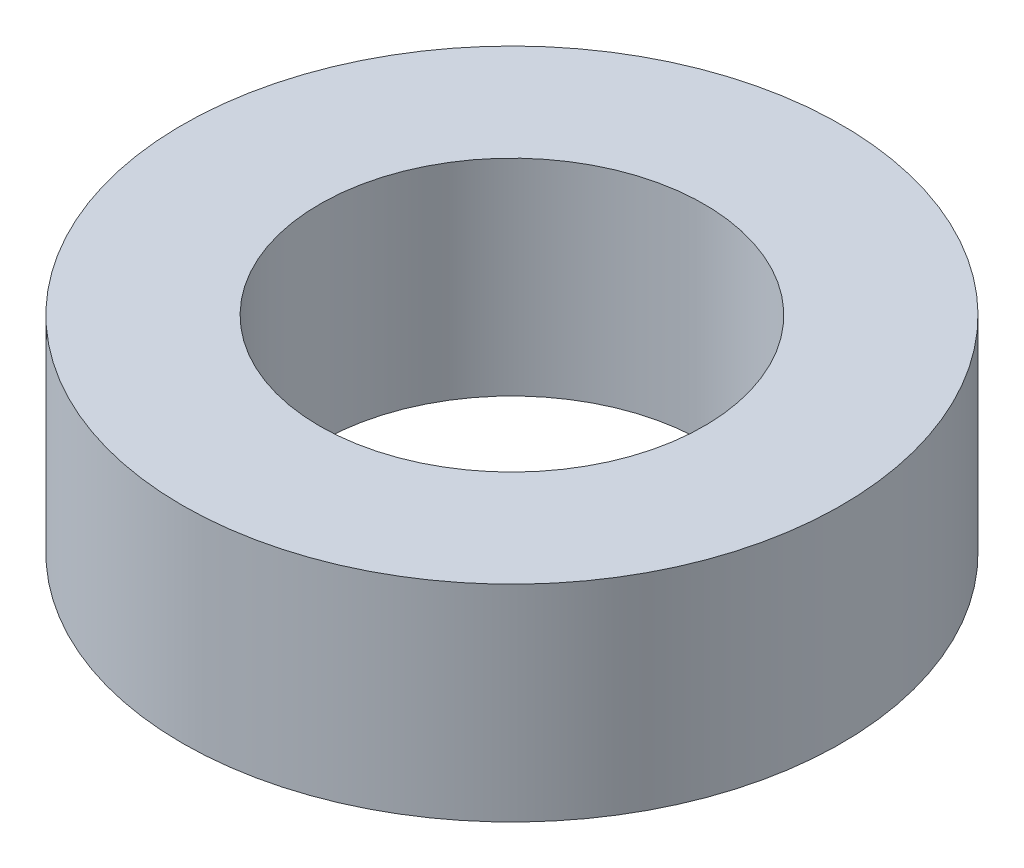
ISO-10303-21;
HEADER;
FILE_DESCRIPTION(('STEP AP214'),'2;1');
FILE_NAME('part.step','',(''),(''),'','','');
FILE_SCHEMA(('AUTOMOTIVE_DESIGN { 1 0 10303 214 1 1 1 1 }'));
ENDSEC;
DATA;
#1=APPLICATION_CONTEXT('core data for automotive mechanical design processes');
#2=APPLICATION_PROTOCOL_DEFINITION('international standard','automotive_design',2000,#1);
#3=PRODUCT_CONTEXT('',#1,'mechanical');
#4=PRODUCT('Part','Part','',(#3));
#5=PRODUCT_RELATED_PRODUCT_CATEGORY('part','',(#4));
#6=PRODUCT_DEFINITION_FORMATION('','',#4);
#7=PRODUCT_DEFINITION_CONTEXT('part definition',#1,'design');
#8=PRODUCT_DEFINITION('design','',#6,#7);
#9=PRODUCT_DEFINITION_SHAPE('','',#8);
#10=(LENGTH_UNIT() NAMED_UNIT(*) SI_UNIT(.MILLI.,.METRE.));
#11=(NAMED_UNIT(*) PLANE_ANGLE_UNIT() SI_UNIT($,.RADIAN.));
#12=(NAMED_UNIT(*) SI_UNIT($,.STERADIAN.) SOLID_ANGLE_UNIT());
#13=UNCERTAINTY_MEASURE_WITH_UNIT(LENGTH_MEASURE(1.E-05),#10,'distance_accuracy_value','');
#14=(GEOMETRIC_REPRESENTATION_CONTEXT(3) GLOBAL_UNCERTAINTY_ASSIGNED_CONTEXT((#13)) GLOBAL_UNIT_ASSIGNED_CONTEXT((#10,
#11,#12)) REPRESENTATION_CONTEXT('',''));
#15=CARTESIAN_POINT('',(0.,0.,0.));
#16=DIRECTION('',(0.,0.,1.));
#17=DIRECTION('',(1.,0.,0.));
#18=AXIS2_PLACEMENT_3D('',#15,#16,#17);
#19=CARTESIAN_POINT('',(0.,1.5,0.));
#20=DIRECTION('',(0.,1.,0.));
#21=DIRECTION('',(0.,0.,1.));
#22=AXIS2_PLACEMENT_3D('',#19,#20,#21);
#23=PLANE('',#22);
#24=CARTESIAN_POINT('',(0.,1.5,0.));
#25=DIRECTION('',(0.,1.,0.));
#26=DIRECTION('',(0.,0.,1.));
#27=AXIS2_PLACEMENT_3D('',#24,#25,#26);
#28=CIRCLE('',#27,2.4);
#29=CARTESIAN_POINT('',(0.,1.5,2.4));
#30=VERTEX_POINT('',#29);
#31=EDGE_CURVE('E10',#30,#30,#28,.T.);
#32=ORIENTED_EDGE('',*,*,#31,.T.);
#33=EDGE_LOOP('',(#32));
#34=FACE_BOUND('',#33,.T.);
#35=CARTESIAN_POINT('',(0.,1.5,0.));
#36=DIRECTION('',(0.,1.,0.));
#37=DIRECTION('',(0.,0.,1.));
#38=AXIS2_PLACEMENT_3D('',#35,#36,#37);
#39=CIRCLE('',#38,1.4);
#40=CARTESIAN_POINT('',(0.,1.5,1.4));
#41=VERTEX_POINT('',#40);
#42=EDGE_CURVE('E42',#41,#41,#39,.T.);
#43=ORIENTED_EDGE('',*,*,#42,.F.);
#44=EDGE_LOOP('',(#43));
#45=FACE_BOUND('',#44,.T.);
#46=ADVANCED_FACE('F31',(#34,#45),#23,.T.);
#47=CARTESIAN_POINT('',(0.,0.,0.));
#48=DIRECTION('',(0.,1.,0.));
#49=DIRECTION('',(0.,0.,1.));
#50=AXIS2_PLACEMENT_3D('',#47,#48,#49);
#51=PLANE('',#50);
#52=CARTESIAN_POINT('',(0.,0.,0.));
#53=DIRECTION('',(0.,1.,0.));
#54=DIRECTION('',(0.,0.,1.));
#55=AXIS2_PLACEMENT_3D('',#52,#53,#54);
#56=CIRCLE('',#55,2.4);
#57=CARTESIAN_POINT('',(0.,0.,2.4));
#58=VERTEX_POINT('',#57);
#59=EDGE_CURVE('E35',#58,#58,#56,.T.);
#60=ORIENTED_EDGE('',*,*,#59,.F.);
#61=EDGE_LOOP('',(#60));
#62=FACE_BOUND('',#61,.T.);
#63=CARTESIAN_POINT('',(0.,0.,0.));
#64=DIRECTION('',(0.,1.,0.));
#65=DIRECTION('',(0.,0.,1.));
#66=AXIS2_PLACEMENT_3D('',#63,#64,#65);
#67=CIRCLE('',#66,1.4);
#68=CARTESIAN_POINT('',(0.,0.,1.4));
#69=VERTEX_POINT('',#68);
#70=EDGE_CURVE('E44',#69,#69,#67,.T.);
#71=ORIENTED_EDGE('',*,*,#70,.T.);
#72=EDGE_LOOP('',(#71));
#73=FACE_BOUND('',#72,.T.);
#74=ADVANCED_FACE('F54',(#62,#73),#51,.F.);
#75=CARTESIAN_POINT('',(0.,1.5,0.));
#76=DIRECTION('',(0.,-1.,0.));
#77=DIRECTION('',(0.,0.,-1.));
#78=AXIS2_PLACEMENT_3D('',#75,#76,#77);
#79=CYLINDRICAL_SURFACE('',#78,2.4);
#80=ORIENTED_EDGE('',*,*,#31,.F.);
#81=EDGE_LOOP('',(#80));
#82=FACE_BOUND('',#81,.T.);
#83=ORIENTED_EDGE('',*,*,#59,.T.);
#84=EDGE_LOOP('',(#83));
#85=FACE_BOUND('',#84,.T.);
#86=ADVANCED_FACE('F33',(#82,#85),#79,.T.);
#87=CARTESIAN_POINT('',(0.,1.5,0.));
#88=DIRECTION('',(0.,-1.,0.));
#89=DIRECTION('',(0.,0.,-1.));
#90=AXIS2_PLACEMENT_3D('',#87,#88,#89);
#91=CYLINDRICAL_SURFACE('',#90,1.4);
#92=ORIENTED_EDGE('',*,*,#42,.T.);
#93=EDGE_LOOP('',(#92));
#94=FACE_BOUND('',#93,.T.);
#95=ORIENTED_EDGE('',*,*,#70,.F.);
#96=EDGE_LOOP('',(#95));
#97=FACE_BOUND('',#96,.T.);
#98=ADVANCED_FACE('F50',(#94,#97),#91,.F.);
#99=CLOSED_SHELL('',(#46,#74,#86,#98));
#100=MANIFOLD_SOLID_BREP('B2',#99);
#101=ADVANCED_BREP_SHAPE_REPRESENTATION('',(#18,#100),#14);
#102=SHAPE_DEFINITION_REPRESENTATION(#9,#101);
ENDSEC;
END-ISO-10303-21;
